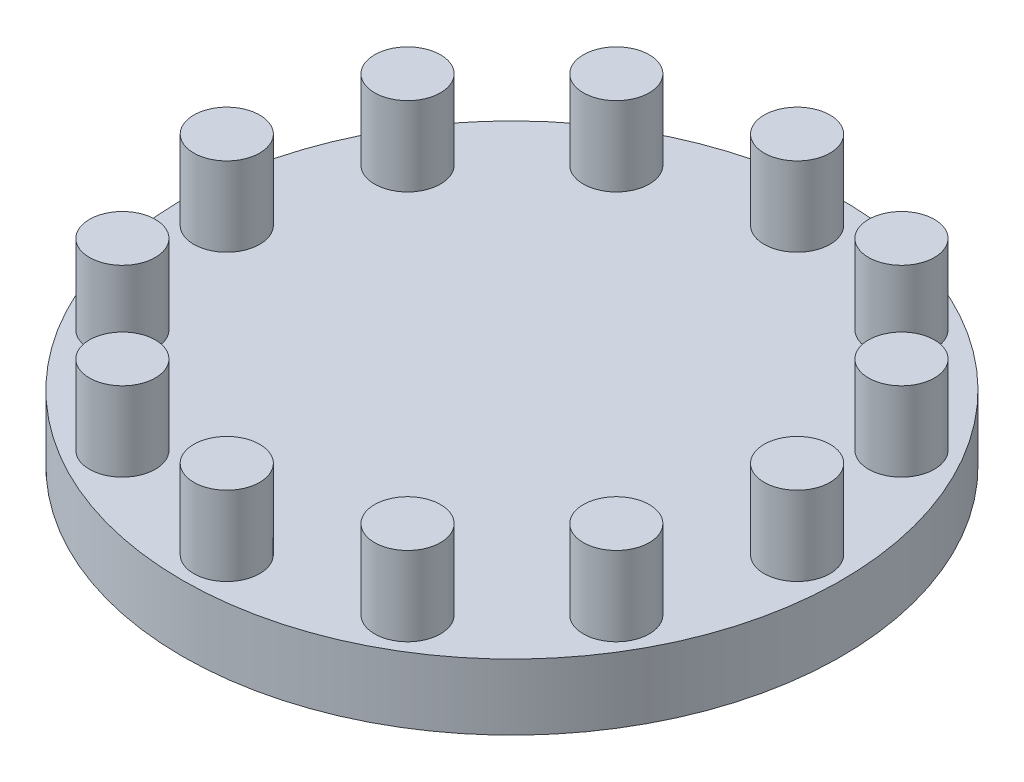
ISO-10303-21;
HEADER;
FILE_DESCRIPTION(('STEP AP214'),'2;1');
FILE_NAME('part.step','',(''),(''),'','','');
FILE_SCHEMA(('AUTOMOTIVE_DESIGN { 1 0 10303 214 1 1 1 1 }'));
ENDSEC;
DATA;
#1=APPLICATION_CONTEXT('core data for automotive mechanical design processes');
#2=APPLICATION_PROTOCOL_DEFINITION('international standard','automotive_design',2000,#1);
#3=PRODUCT_CONTEXT('',#1,'mechanical');
#4=PRODUCT('Part','Part','',(#3));
#5=PRODUCT_RELATED_PRODUCT_CATEGORY('part','',(#4));
#6=PRODUCT_DEFINITION_FORMATION('','',#4);
#7=PRODUCT_DEFINITION_CONTEXT('part definition',#1,'design');
#8=PRODUCT_DEFINITION('design','',#6,#7);
#9=PRODUCT_DEFINITION_SHAPE('','',#8);
#10=(LENGTH_UNIT() NAMED_UNIT(*) SI_UNIT(.MILLI.,.METRE.));
#11=(NAMED_UNIT(*) PLANE_ANGLE_UNIT() SI_UNIT($,.RADIAN.));
#12=(NAMED_UNIT(*) SI_UNIT($,.STERADIAN.) SOLID_ANGLE_UNIT());
#13=UNCERTAINTY_MEASURE_WITH_UNIT(LENGTH_MEASURE(1.E-05),#10,'distance_accuracy_value','');
#14=(GEOMETRIC_REPRESENTATION_CONTEXT(3) GLOBAL_UNCERTAINTY_ASSIGNED_CONTEXT((#13)) GLOBAL_UNIT_ASSIGNED_CONTEXT((#10,
#11,#12)) REPRESENTATION_CONTEXT('',''));
#15=CARTESIAN_POINT('',(0.,0.,0.));
#16=DIRECTION('',(0.,0.,1.));
#17=DIRECTION('',(1.,0.,0.));
#18=AXIS2_PLACEMENT_3D('',#15,#16,#17);
#19=CARTESIAN_POINT('',(0.,10.,0.));
#20=DIRECTION('',(0.,-1.,0.));
#21=DIRECTION('',(0.,0.,-1.));
#22=AXIS2_PLACEMENT_3D('',#19,#20,#21);
#23=CYLINDRICAL_SURFACE('',#22,50.);
#24=CARTESIAN_POINT('',(0.,10.,0.));
#25=DIRECTION('',(0.,1.,0.));
#26=DIRECTION('',(0.,0.,1.));
#27=AXIS2_PLACEMENT_3D('',#24,#25,#26);
#28=CIRCLE('',#27,50.);
#29=CARTESIAN_POINT('',(0.,10.,50.));
#30=VERTEX_POINT('',#29);
#31=EDGE_CURVE('E10',#30,#30,#28,.T.);
#32=ORIENTED_EDGE('',*,*,#31,.F.);
#33=EDGE_LOOP('',(#32));
#34=FACE_BOUND('',#33,.T.);
#35=CARTESIAN_POINT('',(0.,0.,0.));
#36=DIRECTION('',(0.,1.,0.));
#37=DIRECTION('',(0.,0.,1.));
#38=AXIS2_PLACEMENT_3D('',#35,#36,#37);
#39=CIRCLE('',#38,50.);
#40=CARTESIAN_POINT('',(0.,0.,50.));
#41=VERTEX_POINT('',#40);
#42=EDGE_CURVE('E40',#41,#41,#39,.T.);
#43=ORIENTED_EDGE('',*,*,#42,.T.);
#44=EDGE_LOOP('',(#43));
#45=FACE_BOUND('',#44,.T.);
#46=ADVANCED_FACE('F37',(#34,#45),#23,.T.);
#47=CARTESIAN_POINT('',(0.,10.,0.));
#48=DIRECTION('',(0.,1.,0.));
#49=DIRECTION('',(0.,0.,1.));
#50=AXIS2_PLACEMENT_3D('',#47,#48,#49);
#51=PLANE('',#50);
#52=CARTESIAN_POINT('',(21.6320756265427,10.,-37.4678540583454));
#53=DIRECTION('',(0.,1.,0.));
#54=DIRECTION('',(-0.499999999999989,0.,0.866025403784445));
#55=AXIS2_PLACEMENT_3D('',#52,#53,#54);
#56=CIRCLE('',#55,5.);
#57=CARTESIAN_POINT('',(19.1320756265427,10.,-33.1377270394231));
#58=VERTEX_POINT('',#57);
#59=EDGE_CURVE('E115',#58,#58,#56,.T.);
#60=ORIENTED_EDGE('',*,*,#59,.F.);
#61=EDGE_LOOP('',(#60));
#62=FACE_BOUND('',#61,.T.);
#63=CARTESIAN_POINT('',(37.4678540583448,10.,-21.6320756265436));
#64=DIRECTION('',(0.,1.,0.));
#65=DIRECTION('',(-0.866025403784433,0.,0.50000000000001));
#66=AXIS2_PLACEMENT_3D('',#63,#64,#65);
#67=CIRCLE('',#66,5.);
#68=CARTESIAN_POINT('',(33.1377270394227,10.,-19.1320756265435));
#69=VERTEX_POINT('',#68);
#70=EDGE_CURVE('E109',#69,#69,#67,.T.);
#71=ORIENTED_EDGE('',*,*,#70,.F.);
#72=EDGE_LOOP('',(#71));
#73=FACE_BOUND('',#72,.T.);
#74=CARTESIAN_POINT('',(43.2641512530863,10.,-4.53167930223113E-13));
#75=DIRECTION('',(0.,1.,0.));
#76=DIRECTION('',(-1.,0.,0.));
#77=AXIS2_PLACEMENT_3D('',#74,#75,#76);
#78=CIRCLE('',#77,5.);
#79=CARTESIAN_POINT('',(38.2641512530863,10.,-4.00795710140466E-13));
#80=VERTEX_POINT('',#79);
#81=EDGE_CURVE('E103',#80,#80,#78,.T.);
#82=ORIENTED_EDGE('',*,*,#81,.F.);
#83=EDGE_LOOP('',(#82));
#84=FACE_BOUND('',#83,.T.);
#85=CARTESIAN_POINT('',(37.4678540583453,10.,21.6320756265428));
#86=DIRECTION('',(0.,1.,0.));
#87=DIRECTION('',(-0.866025403784443,0.,-0.499999999999992));
#88=AXIS2_PLACEMENT_3D('',#85,#86,#87);
#89=CIRCLE('',#88,5.);
#90=CARTESIAN_POINT('',(33.1377270394231,10.,19.1320756265428));
#91=VERTEX_POINT('',#90);
#92=EDGE_CURVE('E97',#91,#91,#89,.T.);
#93=ORIENTED_EDGE('',*,*,#92,.F.);
#94=EDGE_LOOP('',(#93));
#95=FACE_BOUND('',#94,.T.);
#96=CARTESIAN_POINT('',(21.6320756265435,10.,37.4678540583449));
#97=DIRECTION('',(0.,1.,0.));
#98=DIRECTION('',(-0.500000000000007,0.,-0.866025403784435));
#99=AXIS2_PLACEMENT_3D('',#96,#97,#98);
#100=CIRCLE('',#99,5.);
#101=CARTESIAN_POINT('',(19.1320756265434,10.,33.1377270394227));
#102=VERTEX_POINT('',#101);
#103=EDGE_CURVE('E91',#102,#102,#100,.T.);
#104=ORIENTED_EDGE('',*,*,#103,.F.);
#105=EDGE_LOOP('',(#104));
#106=FACE_BOUND('',#105,.T.);
#107=CARTESIAN_POINT('',(0.,10.,43.2641512530863));
#108=DIRECTION('',(0.,1.,0.));
#109=DIRECTION('',(0.,0.,-1.));
#110=AXIS2_PLACEMENT_3D('',#107,#108,#109);
#111=CIRCLE('',#110,5.);
#112=CARTESIAN_POINT('',(0.,10.,38.2641512530863));
#113=VERTEX_POINT('',#112);
#114=EDGE_CURVE('E85',#113,#113,#111,.T.);
#115=ORIENTED_EDGE('',*,*,#114,.F.);
#116=EDGE_LOOP('',(#115));
#117=FACE_BOUND('',#116,.T.);
#118=CARTESIAN_POINT('',(-21.6320756265429,10.,37.4678540583452));
#119=DIRECTION('',(0.,1.,0.));
#120=DIRECTION('',(0.499999999999995,0.,-0.866025403784442));
#121=AXIS2_PLACEMENT_3D('',#118,#119,#120);
#122=CIRCLE('',#121,5.);
#123=CARTESIAN_POINT('',(-19.132075626543,10.,33.137727039423));
#124=VERTEX_POINT('',#123);
#125=EDGE_CURVE('E79',#124,#124,#122,.T.);
#126=ORIENTED_EDGE('',*,*,#125,.F.);
#127=EDGE_LOOP('',(#126));
#128=FACE_BOUND('',#127,.T.);
#129=CARTESIAN_POINT('',(-37.467854058345,10.,21.6320756265433));
#130=DIRECTION('',(0.,1.,0.));
#131=DIRECTION('',(0.866025403784436,0.,-0.500000000000004));
#132=AXIS2_PLACEMENT_3D('',#129,#130,#131);
#133=CIRCLE('',#132,5.);
#134=CARTESIAN_POINT('',(-33.1377270394228,10.,19.1320756265433));
#135=VERTEX_POINT('',#134);
#136=EDGE_CURVE('E73',#135,#135,#133,.T.);
#137=ORIENTED_EDGE('',*,*,#136,.F.);
#138=EDGE_LOOP('',(#137));
#139=FACE_BOUND('',#138,.T.);
#140=CARTESIAN_POINT('',(-43.2641512530863,10.,1.51055976741038E-13));
#141=DIRECTION('',(0.,1.,0.));
#142=DIRECTION('',(1.,0.,0.));
#143=AXIS2_PLACEMENT_3D('',#140,#141,#142);
#144=CIRCLE('',#143,5.);
#145=CARTESIAN_POINT('',(-38.2641512530863,10.,1.33598570046822E-13));
#146=VERTEX_POINT('',#145);
#147=EDGE_CURVE('E67',#146,#146,#144,.T.);
#148=ORIENTED_EDGE('',*,*,#147,.F.);
#149=EDGE_LOOP('',(#148));
#150=FACE_BOUND('',#149,.T.);
#151=CARTESIAN_POINT('',(-37.4678540583451,10.,-21.6320756265431));
#152=DIRECTION('',(0.,1.,0.));
#153=DIRECTION('',(0.86602540378444,0.,0.499999999999998));
#154=AXIS2_PLACEMENT_3D('',#151,#152,#153);
#155=CIRCLE('',#154,5.);
#156=CARTESIAN_POINT('',(-33.1377270394229,10.,-19.1320756265431));
#157=VERTEX_POINT('',#156);
#158=EDGE_CURVE('E61',#157,#157,#155,.T.);
#159=ORIENTED_EDGE('',*,*,#158,.F.);
#160=EDGE_LOOP('',(#159));
#161=FACE_BOUND('',#160,.T.);
#162=CARTESIAN_POINT('',(-21.6320756265432,10.,-37.4678540583451));
#163=DIRECTION('',(0.,1.,0.));
#164=DIRECTION('',(0.500000000000001,0.,0.866025403784438));
#165=AXIS2_PLACEMENT_3D('',#162,#163,#164);
#166=CIRCLE('',#165,5.);
#167=CARTESIAN_POINT('',(-19.1320756265432,10.,-33.1377270394229));
#168=VERTEX_POINT('',#167);
#169=EDGE_CURVE('E55',#168,#168,#166,.T.);
#170=ORIENTED_EDGE('',*,*,#169,.F.);
#171=EDGE_LOOP('',(#170));
#172=FACE_BOUND('',#171,.T.);
#173=CARTESIAN_POINT('',(0.,10.,-43.2641512530863));
#174=DIRECTION('',(0.,1.,0.));
#175=DIRECTION('',(0.,0.,1.));
#176=AXIS2_PLACEMENT_3D('',#173,#174,#175);
#177=CIRCLE('',#176,5.);
#178=CARTESIAN_POINT('',(0.,10.,-38.2641512530863));
#179=VERTEX_POINT('',#178);
#180=EDGE_CURVE('E49',#179,#179,#177,.T.);
#181=ORIENTED_EDGE('',*,*,#180,.F.);
#182=EDGE_LOOP('',(#181));
#183=FACE_BOUND('',#182,.T.);
#184=ORIENTED_EDGE('',*,*,#31,.T.);
#185=EDGE_LOOP('',(#184));
#186=FACE_BOUND('',#185,.T.);
#187=ADVANCED_FACE('F130',(#62,#73,#84,#95,#106,#117,#128,#139,#150,#161,#172,#183,#186),#51,.T.);
#188=CARTESIAN_POINT('',(0.,0.,0.));
#189=DIRECTION('',(0.,1.,0.));
#190=DIRECTION('',(0.,0.,1.));
#191=AXIS2_PLACEMENT_3D('',#188,#189,#190);
#192=PLANE('',#191);
#193=ORIENTED_EDGE('',*,*,#42,.F.);
#194=EDGE_LOOP('',(#193));
#195=FACE_BOUND('',#194,.T.);
#196=ADVANCED_FACE('F133',(#195),#192,.F.);
#197=CARTESIAN_POINT('',(0.,22.,-43.2641512530863));
#198=DIRECTION('',(0.,-1.,0.));
#199=DIRECTION('',(0.,0.,-1.));
#200=AXIS2_PLACEMENT_3D('',#197,#198,#199);
#201=CYLINDRICAL_SURFACE('',#200,5.);
#202=CARTESIAN_POINT('',(0.,22.,-43.2641512530863));
#203=DIRECTION('',(0.,1.,0.));
#204=DIRECTION('',(0.,0.,1.));
#205=AXIS2_PLACEMENT_3D('',#202,#203,#204);
#206=CIRCLE('',#205,5.);
#207=CARTESIAN_POINT('',(0.,22.,-38.2641512530863));
#208=VERTEX_POINT('',#207);
#209=EDGE_CURVE('E47',#208,#208,#206,.T.);
#210=ORIENTED_EDGE('',*,*,#209,.F.);
#211=EDGE_LOOP('',(#210));
#212=FACE_BOUND('',#211,.T.);
#213=ORIENTED_EDGE('',*,*,#180,.T.);
#214=EDGE_LOOP('',(#213));
#215=FACE_BOUND('',#214,.T.);
#216=ADVANCED_FACE('F157',(#212,#215),#201,.T.);
#217=CARTESIAN_POINT('',(0.,22.,-43.2641512530863));
#218=DIRECTION('',(0.,1.,0.));
#219=DIRECTION('',(0.,0.,1.));
#220=AXIS2_PLACEMENT_3D('',#217,#218,#219);
#221=PLANE('',#220);
#222=ORIENTED_EDGE('',*,*,#209,.T.);
#223=EDGE_LOOP('',(#222));
#224=FACE_BOUND('',#223,.T.);
#225=ADVANCED_FACE('F159',(#224),#221,.T.);
#226=CARTESIAN_POINT('',(-21.6320756265432,22.,-37.4678540583451));
#227=DIRECTION('',(0.,-1.,0.));
#228=DIRECTION('',(0.,0.,-1.));
#229=AXIS2_PLACEMENT_3D('',#226,#227,#228);
#230=CYLINDRICAL_SURFACE('',#229,5.);
#231=CARTESIAN_POINT('',(-21.6320756265432,22.,-37.4678540583451));
#232=DIRECTION('',(0.,1.,0.));
#233=DIRECTION('',(0.500000000000001,0.,0.866025403784438));
#234=AXIS2_PLACEMENT_3D('',#231,#232,#233);
#235=CIRCLE('',#234,5.);
#236=CARTESIAN_POINT('',(-19.1320756265432,22.,-33.1377270394229));
#237=VERTEX_POINT('',#236);
#238=EDGE_CURVE('E52',#237,#237,#235,.T.);
#239=ORIENTED_EDGE('',*,*,#238,.F.);
#240=EDGE_LOOP('',(#239));
#241=FACE_BOUND('',#240,.T.);
#242=ORIENTED_EDGE('',*,*,#169,.T.);
#243=EDGE_LOOP('',(#242));
#244=FACE_BOUND('',#243,.T.);
#245=ADVANCED_FACE('F166',(#241,#244),#230,.T.);
#246=CARTESIAN_POINT('',(-21.6320756265432,22.,-37.4678540583451));
#247=DIRECTION('',(0.,1.,0.));
#248=DIRECTION('',(0.500000000000001,0.,0.866025403784438));
#249=AXIS2_PLACEMENT_3D('',#246,#247,#248);
#250=PLANE('',#249);
#251=ORIENTED_EDGE('',*,*,#238,.T.);
#252=EDGE_LOOP('',(#251));
#253=FACE_BOUND('',#252,.T.);
#254=ADVANCED_FACE('F206',(#253),#250,.T.);
#255=CARTESIAN_POINT('',(-37.4678540583451,22.,-21.6320756265431));
#256=DIRECTION('',(0.,-1.,0.));
#257=DIRECTION('',(0.,0.,-1.));
#258=AXIS2_PLACEMENT_3D('',#255,#256,#257);
#259=CYLINDRICAL_SURFACE('',#258,5.);
#260=CARTESIAN_POINT('',(-37.4678540583451,22.,-21.6320756265431));
#261=DIRECTION('',(0.,1.,0.));
#262=DIRECTION('',(0.86602540378444,0.,0.499999999999998));
#263=AXIS2_PLACEMENT_3D('',#260,#261,#262);
#264=CIRCLE('',#263,5.);
#265=CARTESIAN_POINT('',(-33.1377270394229,22.,-19.1320756265431));
#266=VERTEX_POINT('',#265);
#267=EDGE_CURVE('E58',#266,#266,#264,.T.);
#268=ORIENTED_EDGE('',*,*,#267,.F.);
#269=EDGE_LOOP('',(#268));
#270=FACE_BOUND('',#269,.T.);
#271=ORIENTED_EDGE('',*,*,#158,.T.);
#272=EDGE_LOOP('',(#271));
#273=FACE_BOUND('',#272,.T.);
#274=ADVANCED_FACE('F216',(#270,#273),#259,.T.);
#275=CARTESIAN_POINT('',(-37.4678540583451,22.,-21.6320756265431));
#276=DIRECTION('',(0.,1.,0.));
#277=DIRECTION('',(0.86602540378444,0.,0.499999999999998));
#278=AXIS2_PLACEMENT_3D('',#275,#276,#277);
#279=PLANE('',#278);
#280=ORIENTED_EDGE('',*,*,#267,.T.);
#281=EDGE_LOOP('',(#280));
#282=FACE_BOUND('',#281,.T.);
#283=ADVANCED_FACE('F226',(#282),#279,.T.);
#284=CARTESIAN_POINT('',(-43.2641512530863,22.,1.51055976741038E-13));
#285=DIRECTION('',(0.,-1.,0.));
#286=DIRECTION('',(0.,0.,-1.));
#287=AXIS2_PLACEMENT_3D('',#284,#285,#286);
#288=CYLINDRICAL_SURFACE('',#287,5.);
#289=CARTESIAN_POINT('',(-43.2641512530863,22.,1.51055976741038E-13));
#290=DIRECTION('',(0.,1.,0.));
#291=DIRECTION('',(1.,0.,0.));
#292=AXIS2_PLACEMENT_3D('',#289,#290,#291);
#293=CIRCLE('',#292,5.);
#294=CARTESIAN_POINT('',(-38.2641512530863,22.,1.33598570046822E-13));
#295=VERTEX_POINT('',#294);
#296=EDGE_CURVE('E64',#295,#295,#293,.T.);
#297=ORIENTED_EDGE('',*,*,#296,.F.);
#298=EDGE_LOOP('',(#297));
#299=FACE_BOUND('',#298,.T.);
#300=ORIENTED_EDGE('',*,*,#147,.T.);
#301=EDGE_LOOP('',(#300));
#302=FACE_BOUND('',#301,.T.);
#303=ADVANCED_FACE('F236',(#299,#302),#288,.T.);
#304=CARTESIAN_POINT('',(-43.2641512530863,22.,1.51055976741038E-13));
#305=DIRECTION('',(0.,1.,0.));
#306=DIRECTION('',(1.,0.,0.));
#307=AXIS2_PLACEMENT_3D('',#304,#305,#306);
#308=PLANE('',#307);
#309=ORIENTED_EDGE('',*,*,#296,.T.);
#310=EDGE_LOOP('',(#309));
#311=FACE_BOUND('',#310,.T.);
#312=ADVANCED_FACE('F246',(#311),#308,.T.);
#313=CARTESIAN_POINT('',(-37.467854058345,22.,21.6320756265433));
#314=DIRECTION('',(0.,-1.,0.));
#315=DIRECTION('',(0.,0.,-1.));
#316=AXIS2_PLACEMENT_3D('',#313,#314,#315);
#317=CYLINDRICAL_SURFACE('',#316,5.);
#318=CARTESIAN_POINT('',(-37.467854058345,22.,21.6320756265433));
#319=DIRECTION('',(0.,1.,0.));
#320=DIRECTION('',(0.866025403784436,0.,-0.500000000000004));
#321=AXIS2_PLACEMENT_3D('',#318,#319,#320);
#322=CIRCLE('',#321,5.);
#323=CARTESIAN_POINT('',(-33.1377270394228,22.,19.1320756265433));
#324=VERTEX_POINT('',#323);
#325=EDGE_CURVE('E70',#324,#324,#322,.T.);
#326=ORIENTED_EDGE('',*,*,#325,.F.);
#327=EDGE_LOOP('',(#326));
#328=FACE_BOUND('',#327,.T.);
#329=ORIENTED_EDGE('',*,*,#136,.T.);
#330=EDGE_LOOP('',(#329));
#331=FACE_BOUND('',#330,.T.);
#332=ADVANCED_FACE('F256',(#328,#331),#317,.T.);
#333=CARTESIAN_POINT('',(-37.467854058345,22.,21.6320756265433));
#334=DIRECTION('',(0.,1.,0.));
#335=DIRECTION('',(0.866025403784436,0.,-0.500000000000004));
#336=AXIS2_PLACEMENT_3D('',#333,#334,#335);
#337=PLANE('',#336);
#338=ORIENTED_EDGE('',*,*,#325,.T.);
#339=EDGE_LOOP('',(#338));
#340=FACE_BOUND('',#339,.T.);
#341=ADVANCED_FACE('F266',(#340),#337,.T.);
#342=CARTESIAN_POINT('',(-21.6320756265429,22.,37.4678540583452));
#343=DIRECTION('',(0.,-1.,0.));
#344=DIRECTION('',(0.,0.,-1.));
#345=AXIS2_PLACEMENT_3D('',#342,#343,#344);
#346=CYLINDRICAL_SURFACE('',#345,5.);
#347=CARTESIAN_POINT('',(-21.6320756265429,22.,37.4678540583452));
#348=DIRECTION('',(0.,1.,0.));
#349=DIRECTION('',(0.499999999999995,0.,-0.866025403784442));
#350=AXIS2_PLACEMENT_3D('',#347,#348,#349);
#351=CIRCLE('',#350,5.);
#352=CARTESIAN_POINT('',(-19.132075626543,22.,33.137727039423));
#353=VERTEX_POINT('',#352);
#354=EDGE_CURVE('E76',#353,#353,#351,.T.);
#355=ORIENTED_EDGE('',*,*,#354,.F.);
#356=EDGE_LOOP('',(#355));
#357=FACE_BOUND('',#356,.T.);
#358=ORIENTED_EDGE('',*,*,#125,.T.);
#359=EDGE_LOOP('',(#358));
#360=FACE_BOUND('',#359,.T.);
#361=ADVANCED_FACE('F276',(#357,#360),#346,.T.);
#362=CARTESIAN_POINT('',(-21.6320756265429,22.,37.4678540583452));
#363=DIRECTION('',(0.,1.,0.));
#364=DIRECTION('',(0.499999999999995,0.,-0.866025403784442));
#365=AXIS2_PLACEMENT_3D('',#362,#363,#364);
#366=PLANE('',#365);
#367=ORIENTED_EDGE('',*,*,#354,.T.);
#368=EDGE_LOOP('',(#367));
#369=FACE_BOUND('',#368,.T.);
#370=ADVANCED_FACE('F286',(#369),#366,.T.);
#371=CARTESIAN_POINT('',(0.,22.,43.2641512530863));
#372=DIRECTION('',(0.,-1.,0.));
#373=DIRECTION('',(0.,0.,-1.));
#374=AXIS2_PLACEMENT_3D('',#371,#372,#373);
#375=CYLINDRICAL_SURFACE('',#374,5.);
#376=CARTESIAN_POINT('',(0.,22.,43.2641512530863));
#377=DIRECTION('',(0.,1.,0.));
#378=DIRECTION('',(0.,0.,-1.));
#379=AXIS2_PLACEMENT_3D('',#376,#377,#378);
#380=CIRCLE('',#379,5.);
#381=CARTESIAN_POINT('',(0.,22.,38.2641512530863));
#382=VERTEX_POINT('',#381);
#383=EDGE_CURVE('E82',#382,#382,#380,.T.);
#384=ORIENTED_EDGE('',*,*,#383,.F.);
#385=EDGE_LOOP('',(#384));
#386=FACE_BOUND('',#385,.T.);
#387=ORIENTED_EDGE('',*,*,#114,.T.);
#388=EDGE_LOOP('',(#387));
#389=FACE_BOUND('',#388,.T.);
#390=ADVANCED_FACE('F296',(#386,#389),#375,.T.);
#391=CARTESIAN_POINT('',(0.,22.,43.2641512530863));
#392=DIRECTION('',(0.,1.,0.));
#393=DIRECTION('',(0.,0.,-1.));
#394=AXIS2_PLACEMENT_3D('',#391,#392,#393);
#395=PLANE('',#394);
#396=ORIENTED_EDGE('',*,*,#383,.T.);
#397=EDGE_LOOP('',(#396));
#398=FACE_BOUND('',#397,.T.);
#399=ADVANCED_FACE('F306',(#398),#395,.T.);
#400=CARTESIAN_POINT('',(21.6320756265435,22.,37.4678540583449));
#401=DIRECTION('',(0.,-1.,0.));
#402=DIRECTION('',(0.,0.,-1.));
#403=AXIS2_PLACEMENT_3D('',#400,#401,#402);
#404=CYLINDRICAL_SURFACE('',#403,5.);
#405=CARTESIAN_POINT('',(21.6320756265435,22.,37.4678540583449));
#406=DIRECTION('',(0.,1.,0.));
#407=DIRECTION('',(-0.500000000000007,0.,-0.866025403784435));
#408=AXIS2_PLACEMENT_3D('',#405,#406,#407);
#409=CIRCLE('',#408,5.);
#410=CARTESIAN_POINT('',(19.1320756265434,22.,33.1377270394227));
#411=VERTEX_POINT('',#410);
#412=EDGE_CURVE('E88',#411,#411,#409,.T.);
#413=ORIENTED_EDGE('',*,*,#412,.F.);
#414=EDGE_LOOP('',(#413));
#415=FACE_BOUND('',#414,.T.);
#416=ORIENTED_EDGE('',*,*,#103,.T.);
#417=EDGE_LOOP('',(#416));
#418=FACE_BOUND('',#417,.T.);
#419=ADVANCED_FACE('F316',(#415,#418),#404,.T.);
#420=CARTESIAN_POINT('',(21.6320756265435,22.,37.4678540583449));
#421=DIRECTION('',(0.,1.,0.));
#422=DIRECTION('',(-0.500000000000007,0.,-0.866025403784435));
#423=AXIS2_PLACEMENT_3D('',#420,#421,#422);
#424=PLANE('',#423);
#425=ORIENTED_EDGE('',*,*,#412,.T.);
#426=EDGE_LOOP('',(#425));
#427=FACE_BOUND('',#426,.T.);
#428=ADVANCED_FACE('F326',(#427),#424,.T.);
#429=CARTESIAN_POINT('',(37.4678540583453,22.,21.6320756265428));
#430=DIRECTION('',(0.,-1.,0.));
#431=DIRECTION('',(0.,0.,-1.));
#432=AXIS2_PLACEMENT_3D('',#429,#430,#431);
#433=CYLINDRICAL_SURFACE('',#432,5.);
#434=CARTESIAN_POINT('',(37.4678540583453,22.,21.6320756265428));
#435=DIRECTION('',(0.,1.,0.));
#436=DIRECTION('',(-0.866025403784443,0.,-0.499999999999992));
#437=AXIS2_PLACEMENT_3D('',#434,#435,#436);
#438=CIRCLE('',#437,5.);
#439=CARTESIAN_POINT('',(33.1377270394231,22.,19.1320756265428));
#440=VERTEX_POINT('',#439);
#441=EDGE_CURVE('E94',#440,#440,#438,.T.);
#442=ORIENTED_EDGE('',*,*,#441,.F.);
#443=EDGE_LOOP('',(#442));
#444=FACE_BOUND('',#443,.T.);
#445=ORIENTED_EDGE('',*,*,#92,.T.);
#446=EDGE_LOOP('',(#445));
#447=FACE_BOUND('',#446,.T.);
#448=ADVANCED_FACE('F336',(#444,#447),#433,.T.);
#449=CARTESIAN_POINT('',(37.4678540583453,22.,21.6320756265428));
#450=DIRECTION('',(0.,1.,0.));
#451=DIRECTION('',(-0.866025403784443,0.,-0.499999999999992));
#452=AXIS2_PLACEMENT_3D('',#449,#450,#451);
#453=PLANE('',#452);
#454=ORIENTED_EDGE('',*,*,#441,.T.);
#455=EDGE_LOOP('',(#454));
#456=FACE_BOUND('',#455,.T.);
#457=ADVANCED_FACE('F346',(#456),#453,.T.);
#458=CARTESIAN_POINT('',(43.2641512530863,22.,-4.53167930223113E-13));
#459=DIRECTION('',(0.,-1.,0.));
#460=DIRECTION('',(0.,0.,-1.));
#461=AXIS2_PLACEMENT_3D('',#458,#459,#460);
#462=CYLINDRICAL_SURFACE('',#461,5.);
#463=CARTESIAN_POINT('',(43.2641512530863,22.,-4.53167930223113E-13));
#464=DIRECTION('',(0.,1.,0.));
#465=DIRECTION('',(-1.,0.,0.));
#466=AXIS2_PLACEMENT_3D('',#463,#464,#465);
#467=CIRCLE('',#466,5.);
#468=CARTESIAN_POINT('',(38.2641512530863,22.,-4.00795710140466E-13));
#469=VERTEX_POINT('',#468);
#470=EDGE_CURVE('E100',#469,#469,#467,.T.);
#471=ORIENTED_EDGE('',*,*,#470,.F.);
#472=EDGE_LOOP('',(#471));
#473=FACE_BOUND('',#472,.T.);
#474=ORIENTED_EDGE('',*,*,#81,.T.);
#475=EDGE_LOOP('',(#474));
#476=FACE_BOUND('',#475,.T.);
#477=ADVANCED_FACE('F356',(#473,#476),#462,.T.);
#478=CARTESIAN_POINT('',(43.2641512530863,22.,-4.53167930223113E-13));
#479=DIRECTION('',(0.,1.,0.));
#480=DIRECTION('',(-1.,0.,0.));
#481=AXIS2_PLACEMENT_3D('',#478,#479,#480);
#482=PLANE('',#481);
#483=ORIENTED_EDGE('',*,*,#470,.T.);
#484=EDGE_LOOP('',(#483));
#485=FACE_BOUND('',#484,.T.);
#486=ADVANCED_FACE('F366',(#485),#482,.T.);
#487=CARTESIAN_POINT('',(37.4678540583448,22.,-21.6320756265436));
#488=DIRECTION('',(0.,-1.,0.));
#489=DIRECTION('',(0.,0.,-1.));
#490=AXIS2_PLACEMENT_3D('',#487,#488,#489);
#491=CYLINDRICAL_SURFACE('',#490,5.);
#492=CARTESIAN_POINT('',(37.4678540583448,22.,-21.6320756265436));
#493=DIRECTION('',(0.,1.,0.));
#494=DIRECTION('',(-0.866025403784433,0.,0.50000000000001));
#495=AXIS2_PLACEMENT_3D('',#492,#493,#494);
#496=CIRCLE('',#495,5.);
#497=CARTESIAN_POINT('',(33.1377270394227,22.,-19.1320756265435));
#498=VERTEX_POINT('',#497);
#499=EDGE_CURVE('E106',#498,#498,#496,.T.);
#500=ORIENTED_EDGE('',*,*,#499,.F.);
#501=EDGE_LOOP('',(#500));
#502=FACE_BOUND('',#501,.T.);
#503=ORIENTED_EDGE('',*,*,#70,.T.);
#504=EDGE_LOOP('',(#503));
#505=FACE_BOUND('',#504,.T.);
#506=ADVANCED_FACE('F376',(#502,#505),#491,.T.);
#507=CARTESIAN_POINT('',(37.4678540583448,22.,-21.6320756265436));
#508=DIRECTION('',(0.,1.,0.));
#509=DIRECTION('',(-0.866025403784433,0.,0.50000000000001));
#510=AXIS2_PLACEMENT_3D('',#507,#508,#509);
#511=PLANE('',#510);
#512=ORIENTED_EDGE('',*,*,#499,.T.);
#513=EDGE_LOOP('',(#512));
#514=FACE_BOUND('',#513,.T.);
#515=ADVANCED_FACE('F126',(#514),#511,.T.);
#516=CARTESIAN_POINT('',(21.6320756265427,22.,-37.4678540583454));
#517=DIRECTION('',(0.,-1.,0.));
#518=DIRECTION('',(0.,0.,-1.));
#519=AXIS2_PLACEMENT_3D('',#516,#517,#518);
#520=CYLINDRICAL_SURFACE('',#519,5.);
#521=CARTESIAN_POINT('',(21.6320756265427,22.,-37.4678540583454));
#522=DIRECTION('',(0.,1.,0.));
#523=DIRECTION('',(-0.499999999999989,0.,0.866025403784445));
#524=AXIS2_PLACEMENT_3D('',#521,#522,#523);
#525=CIRCLE('',#524,5.);
#526=CARTESIAN_POINT('',(19.1320756265427,22.,-33.1377270394231));
#527=VERTEX_POINT('',#526);
#528=EDGE_CURVE('E112',#527,#527,#525,.T.);
#529=ORIENTED_EDGE('',*,*,#528,.F.);
#530=EDGE_LOOP('',(#529));
#531=FACE_BOUND('',#530,.T.);
#532=ORIENTED_EDGE('',*,*,#59,.T.);
#533=EDGE_LOOP('',(#532));
#534=FACE_BOUND('',#533,.T.);
#535=ADVANCED_FACE('F123',(#531,#534),#520,.T.);
#536=CARTESIAN_POINT('',(21.6320756265427,22.,-37.4678540583454));
#537=DIRECTION('',(0.,1.,0.));
#538=DIRECTION('',(-0.499999999999989,0.,0.866025403784445));
#539=AXIS2_PLACEMENT_3D('',#536,#537,#538);
#540=PLANE('',#539);
#541=ORIENTED_EDGE('',*,*,#528,.T.);
#542=EDGE_LOOP('',(#541));
#543=FACE_BOUND('',#542,.T.);
#544=ADVANCED_FACE('F121',(#543),#540,.T.);
#545=CLOSED_SHELL('',(#46,#187,#196,#216,#225,#245,#254,#274,#283,#303,#312,#332,#341,#361,#370,
#390,#399,#419,#428,#448,#457,#477,#486,#506,#515,#535,#544));
#546=MANIFOLD_SOLID_BREP('B2',#545);
#547=ADVANCED_BREP_SHAPE_REPRESENTATION('',(#18,#546),#14);
#548=SHAPE_DEFINITION_REPRESENTATION(#9,#547);
ENDSEC;
END-ISO-10303-21;
